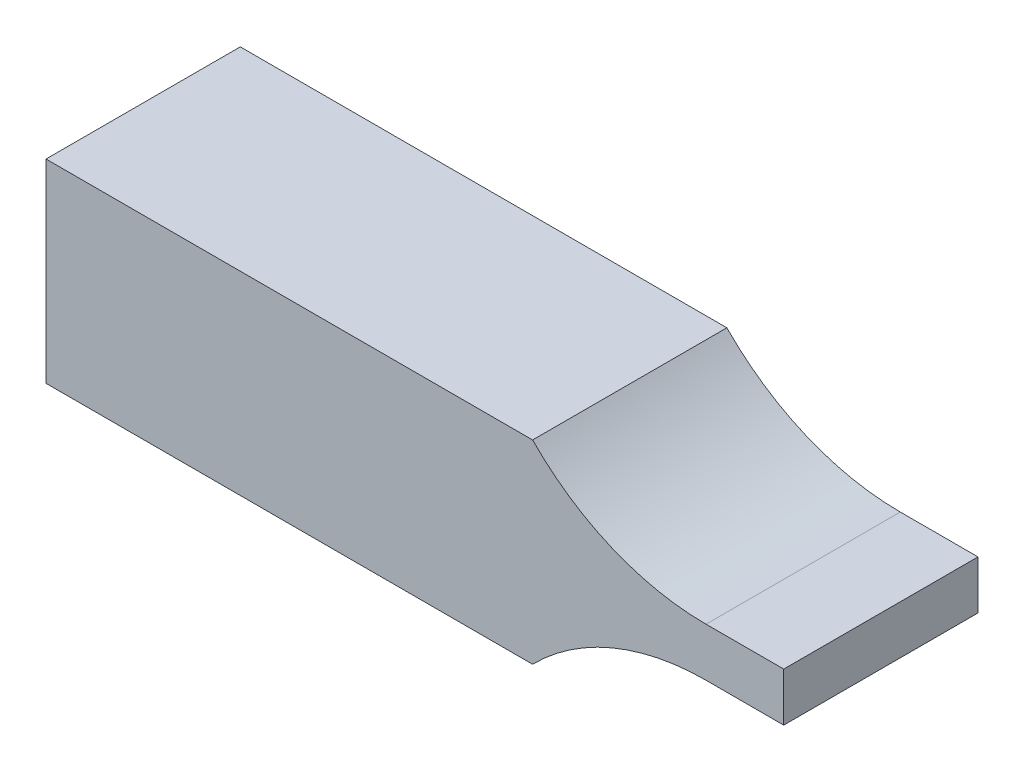
ISO-10303-21;
HEADER;
FILE_DESCRIPTION(('STEP AP214'),'2;1');
FILE_NAME('part.step','',(''),(''),'','','');
FILE_SCHEMA(('AUTOMOTIVE_DESIGN { 1 0 10303 214 1 1 1 1 }'));
ENDSEC;
DATA;
#1=APPLICATION_CONTEXT('core data for automotive mechanical design processes');
#2=APPLICATION_PROTOCOL_DEFINITION('international standard','automotive_design',2000,#1);
#3=PRODUCT_CONTEXT('',#1,'mechanical');
#4=PRODUCT('Part','Part','',(#3));
#5=PRODUCT_RELATED_PRODUCT_CATEGORY('part','',(#4));
#6=PRODUCT_DEFINITION_FORMATION('','',#4);
#7=PRODUCT_DEFINITION_CONTEXT('part definition',#1,'design');
#8=PRODUCT_DEFINITION('design','',#6,#7);
#9=PRODUCT_DEFINITION_SHAPE('','',#8);
#10=(LENGTH_UNIT() NAMED_UNIT(*) SI_UNIT(.MILLI.,.METRE.));
#11=(NAMED_UNIT(*) PLANE_ANGLE_UNIT() SI_UNIT($,.RADIAN.));
#12=(NAMED_UNIT(*) SI_UNIT($,.STERADIAN.) SOLID_ANGLE_UNIT());
#13=UNCERTAINTY_MEASURE_WITH_UNIT(LENGTH_MEASURE(1.E-05),#10,'distance_accuracy_value','');
#14=(GEOMETRIC_REPRESENTATION_CONTEXT(3) GLOBAL_UNCERTAINTY_ASSIGNED_CONTEXT((#13)) GLOBAL_UNIT_ASSIGNED_CONTEXT((#10,
#11,#12)) REPRESENTATION_CONTEXT('',''));
#15=CARTESIAN_POINT('',(0.,0.,0.));
#16=DIRECTION('',(0.,0.,1.));
#17=DIRECTION('',(1.,0.,0.));
#18=AXIS2_PLACEMENT_3D('',#15,#16,#17);
#19=CARTESIAN_POINT('',(22.3176988670607,10.9500737175547,10.));
#20=DIRECTION('',(0.,0.,-1.));
#21=DIRECTION('',(-1.,0.,0.));
#22=AXIS2_PLACEMENT_3D('',#19,#20,#21);
#23=CYLINDRICAL_SURFACE('',#22,25.);
#24=CARTESIAN_POINT('',(22.3176988670607,10.9500737175547,-10.));
#25=DIRECTION('',(0.,0.,-1.));
#26=DIRECTION('',(1.,0.,0.));
#27=AXIS2_PLACEMENT_3D('',#24,#25,#26);
#28=CIRCLE('',#27,25.);
#29=CARTESIAN_POINT('',(22.3176988670607,-14.0499262824453,-10.));
#30=VERTEX_POINT('',#29);
#31=CARTESIAN_POINT('',(4.46412779570355,-6.54992628244534,-10.));
#32=VERTEX_POINT('',#31);
#33=EDGE_CURVE('E131',#30,#32,#28,.T.);
#34=ORIENTED_EDGE('',*,*,#33,.T.);
#35=DIRECTION('',(0.,0.,-1.));
#36=VECTOR('',#35,1.);
#37=CARTESIAN_POINT('',(4.46412779570355,-6.54992628244534,10.));
#38=LINE('',#37,#36);
#39=CARTESIAN_POINT('',(4.46412779570355,-6.54992628244534,10.));
#40=VERTEX_POINT('',#39);
#41=EDGE_CURVE('E11',#40,#32,#38,.T.);
#42=ORIENTED_EDGE('',*,*,#41,.F.);
#43=CARTESIAN_POINT('',(22.3176988670607,10.9500737175547,10.));
#44=DIRECTION('',(0.,0.,-1.));
#45=DIRECTION('',(1.,0.,0.));
#46=AXIS2_PLACEMENT_3D('',#43,#44,#45);
#47=CIRCLE('',#46,25.);
#48=CARTESIAN_POINT('',(22.3176988670607,-14.0499262824453,10.));
#49=VERTEX_POINT('',#48);
#50=EDGE_CURVE('E145',#49,#40,#47,.T.);
#51=ORIENTED_EDGE('',*,*,#50,.F.);
#52=DIRECTION('',(0.,0.,-1.));
#53=VECTOR('',#52,1.);
#54=CARTESIAN_POINT('',(22.3176988670607,-14.0499262824453,10.));
#55=LINE('',#54,#53);
#56=EDGE_CURVE('E127',#49,#30,#55,.T.);
#57=ORIENTED_EDGE('',*,*,#56,.T.);
#58=EDGE_LOOP('',(#34,#42,#51,#57));
#59=FACE_BOUND('',#58,.T.);
#60=ADVANCED_FACE('F35',(#59),#23,.F.);
#61=CARTESIAN_POINT('',(4.46412779570355,-6.54992628244534,10.));
#62=DIRECTION('',(0.,-1.,0.));
#63=DIRECTION('',(1.,0.,0.));
#64=AXIS2_PLACEMENT_3D('',#61,#62,#63);
#65=PLANE('',#64);
#66=DIRECTION('',(-1.,0.,0.));
#67=VECTOR('',#66,1.);
#68=CARTESIAN_POINT('',(4.46412779570355,-6.54992628244534,-10.));
#69=LINE('',#68,#67);
#70=CARTESIAN_POINT('',(-45.6306625816117,-6.54992628244534,-10.));
#71=VERTEX_POINT('',#70);
#72=EDGE_CURVE('E134',#32,#71,#69,.T.);
#73=ORIENTED_EDGE('',*,*,#72,.T.);
#74=DIRECTION('',(0.,0.,-1.));
#75=VECTOR('',#74,1.);
#76=CARTESIAN_POINT('',(-45.6306625816117,-6.54992628244534,10.));
#77=LINE('',#76,#75);
#78=CARTESIAN_POINT('',(-45.6306625816117,-6.54992628244534,10.));
#79=VERTEX_POINT('',#78);
#80=EDGE_CURVE('E43',#79,#71,#77,.T.);
#81=ORIENTED_EDGE('',*,*,#80,.F.);
#82=DIRECTION('',(-1.,0.,0.));
#83=VECTOR('',#82,1.);
#84=CARTESIAN_POINT('',(4.46412779570355,-6.54992628244534,10.));
#85=LINE('',#84,#83);
#86=EDGE_CURVE('E94',#40,#79,#85,.T.);
#87=ORIENTED_EDGE('',*,*,#86,.F.);
#88=ORIENTED_EDGE('',*,*,#41,.T.);
#89=EDGE_LOOP('',(#73,#81,#87,#88));
#90=FACE_BOUND('',#89,.T.);
#91=ADVANCED_FACE('F180',(#90),#65,.F.);
#92=CARTESIAN_POINT('',(-45.6306625816117,-6.54992628244534,10.));
#93=DIRECTION('',(1.,0.,0.));
#94=DIRECTION('',(0.,0.,-1.));
#95=AXIS2_PLACEMENT_3D('',#92,#93,#94);
#96=PLANE('',#95);
#97=DIRECTION('',(0.,-1.,0.));
#98=VECTOR('',#97,1.);
#99=CARTESIAN_POINT('',(-45.6306625816117,-6.54992628244534,-10.));
#100=LINE('',#99,#98);
#101=CARTESIAN_POINT('',(-45.6306625816117,-26.5499262824453,-10.));
#102=VERTEX_POINT('',#101);
#103=EDGE_CURVE('E136',#71,#102,#100,.T.);
#104=ORIENTED_EDGE('',*,*,#103,.T.);
#105=DIRECTION('',(0.,0.,-1.));
#106=VECTOR('',#105,1.);
#107=CARTESIAN_POINT('',(-45.6306625816117,-26.5499262824453,10.));
#108=LINE('',#107,#106);
#109=CARTESIAN_POINT('',(-45.6306625816117,-26.5499262824453,10.));
#110=VERTEX_POINT('',#109);
#111=EDGE_CURVE('E152',#110,#102,#108,.T.);
#112=ORIENTED_EDGE('',*,*,#111,.F.);
#113=DIRECTION('',(0.,-1.,0.));
#114=VECTOR('',#113,1.);
#115=CARTESIAN_POINT('',(-45.6306625816117,-6.54992628244534,10.));
#116=LINE('',#115,#114);
#117=EDGE_CURVE('E160',#79,#110,#116,.T.);
#118=ORIENTED_EDGE('',*,*,#117,.F.);
#119=ORIENTED_EDGE('',*,*,#80,.T.);
#120=EDGE_LOOP('',(#104,#112,#118,#119));
#121=FACE_BOUND('',#120,.T.);
#122=ADVANCED_FACE('F158',(#121),#96,.F.);
#123=CARTESIAN_POINT('',(-45.6306625816117,-26.5499262824453,10.));
#124=DIRECTION('',(0.,1.,0.));
#125=DIRECTION('',(0.,0.,1.));
#126=AXIS2_PLACEMENT_3D('',#123,#124,#125);
#127=PLANE('',#126);
#128=DIRECTION('',(1.,0.,0.));
#129=VECTOR('',#128,1.);
#130=CARTESIAN_POINT('',(-45.6306625816117,-26.5499262824453,-10.));
#131=LINE('',#130,#129);
#132=CARTESIAN_POINT('',(4.46412779570355,-26.5499262824453,-10.));
#133=VERTEX_POINT('',#132);
#134=EDGE_CURVE('E138',#102,#133,#131,.T.);
#135=ORIENTED_EDGE('',*,*,#134,.T.);
#136=DIRECTION('',(0.,0.,-1.));
#137=VECTOR('',#136,1.);
#138=CARTESIAN_POINT('',(4.46412779570355,-26.5499262824453,10.));
#139=LINE('',#138,#137);
#140=CARTESIAN_POINT('',(4.46412779570355,-26.5499262824453,10.));
#141=VERTEX_POINT('',#140);
#142=EDGE_CURVE('E149',#141,#133,#139,.T.);
#143=ORIENTED_EDGE('',*,*,#142,.F.);
#144=DIRECTION('',(1.,0.,0.));
#145=VECTOR('',#144,1.);
#146=CARTESIAN_POINT('',(-45.6306625816117,-26.5499262824453,10.));
#147=LINE('',#146,#145);
#148=EDGE_CURVE('E172',#110,#141,#147,.T.);
#149=ORIENTED_EDGE('',*,*,#148,.F.);
#150=ORIENTED_EDGE('',*,*,#111,.T.);
#151=EDGE_LOOP('',(#135,#143,#149,#150));
#152=FACE_BOUND('',#151,.T.);
#153=ADVANCED_FACE('F168',(#152),#127,.F.);
#154=CARTESIAN_POINT('',(22.3176988670607,-44.0499262824453,10.));
#155=DIRECTION('',(0.,0.,-1.));
#156=DIRECTION('',(-1.,0.,0.));
#157=AXIS2_PLACEMENT_3D('',#154,#155,#156);
#158=CYLINDRICAL_SURFACE('',#157,25.);
#159=CARTESIAN_POINT('',(22.3176988670607,-44.0499262824453,-10.));
#160=DIRECTION('',(0.,0.,-1.));
#161=DIRECTION('',(-1.,0.,0.));
#162=AXIS2_PLACEMENT_3D('',#159,#160,#161);
#163=CIRCLE('',#162,25.);
#164=CARTESIAN_POINT('',(22.3176988670607,-19.0499262824453,-10.));
#165=VERTEX_POINT('',#164);
#166=EDGE_CURVE('E140',#133,#165,#163,.T.);
#167=ORIENTED_EDGE('',*,*,#166,.T.);
#168=DIRECTION('',(0.,0.,-1.));
#169=VECTOR('',#168,1.);
#170=CARTESIAN_POINT('',(22.3176988670607,-19.0499262824453,10.));
#171=LINE('',#170,#169);
#172=CARTESIAN_POINT('',(22.3176988670607,-19.0499262824453,10.));
#173=VERTEX_POINT('',#172);
#174=EDGE_CURVE('E122',#173,#165,#171,.T.);
#175=ORIENTED_EDGE('',*,*,#174,.F.);
#176=CARTESIAN_POINT('',(22.3176988670607,-44.0499262824453,10.));
#177=DIRECTION('',(0.,0.,-1.));
#178=DIRECTION('',(-1.,0.,0.));
#179=AXIS2_PLACEMENT_3D('',#176,#177,#178);
#180=CIRCLE('',#179,25.);
#181=EDGE_CURVE('E113',#141,#173,#180,.T.);
#182=ORIENTED_EDGE('',*,*,#181,.F.);
#183=ORIENTED_EDGE('',*,*,#142,.T.);
#184=EDGE_LOOP('',(#167,#175,#182,#183));
#185=FACE_BOUND('',#184,.T.);
#186=ADVANCED_FACE('F171',(#185),#158,.F.);
#187=CARTESIAN_POINT('',(30.3176988670607,-19.0499262824453,10.));
#188=DIRECTION('',(0.,1.,0.));
#189=DIRECTION('',(-1.,0.,0.));
#190=AXIS2_PLACEMENT_3D('',#187,#188,#189);
#191=PLANE('',#190);
#192=DIRECTION('',(1.,0.,0.));
#193=VECTOR('',#192,1.);
#194=CARTESIAN_POINT('',(30.3176988670607,-19.0499262824453,-10.));
#195=LINE('',#194,#193);
#196=CARTESIAN_POINT('',(30.3176988670607,-19.0499262824453,-10.));
#197=VERTEX_POINT('',#196);
#198=EDGE_CURVE('E121',#165,#197,#195,.T.);
#199=ORIENTED_EDGE('',*,*,#198,.T.);
#200=DIRECTION('',(0.,0.,-1.));
#201=VECTOR('',#200,1.);
#202=CARTESIAN_POINT('',(30.3176988670607,-19.0499262824453,10.));
#203=LINE('',#202,#201);
#204=CARTESIAN_POINT('',(30.3176988670607,-19.0499262824453,10.));
#205=VERTEX_POINT('',#204);
#206=EDGE_CURVE('E118',#205,#197,#203,.T.);
#207=ORIENTED_EDGE('',*,*,#206,.F.);
#208=DIRECTION('',(1.,0.,0.));
#209=VECTOR('',#208,1.);
#210=CARTESIAN_POINT('',(30.3176988670607,-19.0499262824453,10.));
#211=LINE('',#210,#209);
#212=EDGE_CURVE('E107',#173,#205,#211,.T.);
#213=ORIENTED_EDGE('',*,*,#212,.F.);
#214=ORIENTED_EDGE('',*,*,#174,.T.);
#215=EDGE_LOOP('',(#199,#207,#213,#214));
#216=FACE_BOUND('',#215,.T.);
#217=ADVANCED_FACE('F119',(#216),#191,.F.);
#218=CARTESIAN_POINT('',(30.3176988670607,-14.0499262824453,10.));
#219=DIRECTION('',(-1.,0.,0.));
#220=DIRECTION('',(0.,0.,1.));
#221=AXIS2_PLACEMENT_3D('',#218,#219,#220);
#222=PLANE('',#221);
#223=DIRECTION('',(0.,1.,0.));
#224=VECTOR('',#223,1.);
#225=CARTESIAN_POINT('',(30.3176988670607,-14.0499262824453,-10.));
#226=LINE('',#225,#224);
#227=CARTESIAN_POINT('',(30.3176988670607,-14.0499262824453,-10.));
#228=VERTEX_POINT('',#227);
#229=EDGE_CURVE('E80',#197,#228,#226,.T.);
#230=ORIENTED_EDGE('',*,*,#229,.T.);
#231=DIRECTION('',(0.,0.,-1.));
#232=VECTOR('',#231,1.);
#233=CARTESIAN_POINT('',(30.3176988670607,-14.0499262824453,10.));
#234=LINE('',#233,#232);
#235=CARTESIAN_POINT('',(30.3176988670607,-14.0499262824453,10.));
#236=VERTEX_POINT('',#235);
#237=EDGE_CURVE('E123',#236,#228,#234,.T.);
#238=ORIENTED_EDGE('',*,*,#237,.F.);
#239=DIRECTION('',(0.,1.,0.));
#240=VECTOR('',#239,1.);
#241=CARTESIAN_POINT('',(30.3176988670607,-14.0499262824453,10.));
#242=LINE('',#241,#240);
#243=EDGE_CURVE('E111',#205,#236,#242,.T.);
#244=ORIENTED_EDGE('',*,*,#243,.F.);
#245=ORIENTED_EDGE('',*,*,#206,.T.);
#246=EDGE_LOOP('',(#230,#238,#244,#245));
#247=FACE_BOUND('',#246,.T.);
#248=ADVANCED_FACE('F125',(#247),#222,.F.);
#249=CARTESIAN_POINT('',(22.3176988670607,-14.0499262824453,10.));
#250=DIRECTION('',(0.,-1.,0.));
#251=DIRECTION('',(1.,0.,0.));
#252=AXIS2_PLACEMENT_3D('',#249,#250,#251);
#253=PLANE('',#252);
#254=DIRECTION('',(-1.,0.,0.));
#255=VECTOR('',#254,1.);
#256=CARTESIAN_POINT('',(22.3176988670607,-14.0499262824453,-10.));
#257=LINE('',#256,#255);
#258=EDGE_CURVE('E86',#228,#30,#257,.T.);
#259=ORIENTED_EDGE('',*,*,#258,.T.);
#260=ORIENTED_EDGE('',*,*,#56,.F.);
#261=DIRECTION('',(-1.,0.,0.));
#262=VECTOR('',#261,1.);
#263=CARTESIAN_POINT('',(22.3176988670607,-14.0499262824453,10.));
#264=LINE('',#263,#262);
#265=EDGE_CURVE('E51',#236,#49,#264,.T.);
#266=ORIENTED_EDGE('',*,*,#265,.F.);
#267=ORIENTED_EDGE('',*,*,#237,.T.);
#268=EDGE_LOOP('',(#259,#260,#266,#267));
#269=FACE_BOUND('',#268,.T.);
#270=ADVANCED_FACE('F196',(#269),#253,.F.);
#271=CARTESIAN_POINT('',(22.3176988670607,10.9500737175547,10.));
#272=DIRECTION('',(0.,0.,1.));
#273=DIRECTION('',(1.,0.,0.));
#274=AXIS2_PLACEMENT_3D('',#271,#272,#273);
#275=PLANE('',#274);
#276=ORIENTED_EDGE('',*,*,#50,.T.);
#277=ORIENTED_EDGE('',*,*,#86,.T.);
#278=ORIENTED_EDGE('',*,*,#117,.T.);
#279=ORIENTED_EDGE('',*,*,#148,.T.);
#280=ORIENTED_EDGE('',*,*,#181,.T.);
#281=ORIENTED_EDGE('',*,*,#212,.T.);
#282=ORIENTED_EDGE('',*,*,#243,.T.);
#283=ORIENTED_EDGE('',*,*,#265,.T.);
#284=EDGE_LOOP('',(#276,#277,#278,#279,#280,#281,#282,#283));
#285=FACE_BOUND('',#284,.T.);
#286=ADVANCED_FACE('F109',(#285),#275,.T.);
#287=CARTESIAN_POINT('',(22.3176988670607,10.9500737175547,-10.));
#288=DIRECTION('',(0.,0.,1.));
#289=DIRECTION('',(1.,0.,0.));
#290=AXIS2_PLACEMENT_3D('',#287,#288,#289);
#291=PLANE('',#290);
#292=ORIENTED_EDGE('',*,*,#33,.F.);
#293=ORIENTED_EDGE('',*,*,#258,.F.);
#294=ORIENTED_EDGE('',*,*,#229,.F.);
#295=ORIENTED_EDGE('',*,*,#198,.F.);
#296=ORIENTED_EDGE('',*,*,#166,.F.);
#297=ORIENTED_EDGE('',*,*,#134,.F.);
#298=ORIENTED_EDGE('',*,*,#103,.F.);
#299=ORIENTED_EDGE('',*,*,#72,.F.);
#300=EDGE_LOOP('',(#292,#293,#294,#295,#296,#297,#298,#299));
#301=FACE_BOUND('',#300,.T.);
#302=ADVANCED_FACE('F164',(#301),#291,.F.);
#303=CLOSED_SHELL('',(#60,#91,#122,#153,#186,#217,#248,#270,#286,#302));
#304=MANIFOLD_SOLID_BREP('B2',#303);
#305=ADVANCED_BREP_SHAPE_REPRESENTATION('',(#18,#304),#14);
#306=SHAPE_DEFINITION_REPRESENTATION(#9,#305);
ENDSEC;
END-ISO-10303-21;
